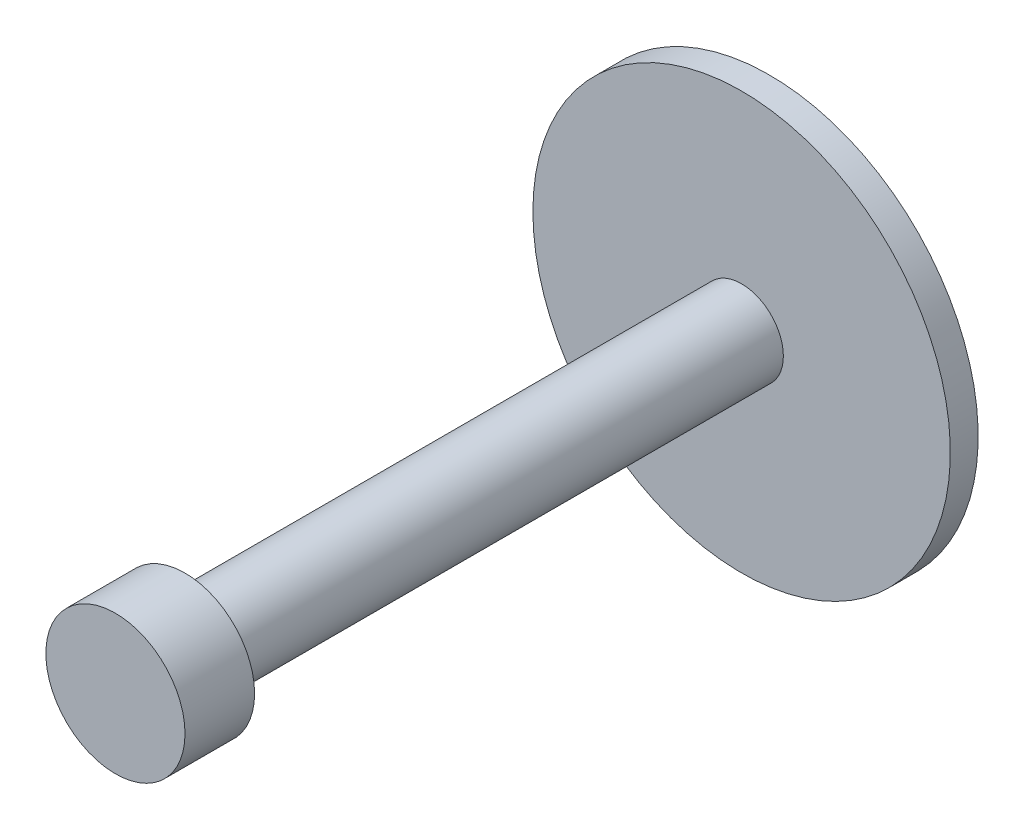
ISO-10303-21;
HEADER;
FILE_DESCRIPTION(('STEP AP214'),'2;1');
FILE_NAME('part.step','',(''),(''),'','','');
FILE_SCHEMA(('AUTOMOTIVE_DESIGN { 1 0 10303 214 1 1 1 1 }'));
ENDSEC;
DATA;
#1=APPLICATION_CONTEXT('core data for automotive mechanical design processes');
#2=APPLICATION_PROTOCOL_DEFINITION('international standard','automotive_design',2000,#1);
#3=PRODUCT_CONTEXT('',#1,'mechanical');
#4=PRODUCT('Part','Part','',(#3));
#5=PRODUCT_RELATED_PRODUCT_CATEGORY('part','',(#4));
#6=PRODUCT_DEFINITION_FORMATION('','',#4);
#7=PRODUCT_DEFINITION_CONTEXT('part definition',#1,'design');
#8=PRODUCT_DEFINITION('design','',#6,#7);
#9=PRODUCT_DEFINITION_SHAPE('','',#8);
#10=(LENGTH_UNIT() NAMED_UNIT(*) SI_UNIT(.MILLI.,.METRE.));
#11=(NAMED_UNIT(*) PLANE_ANGLE_UNIT() SI_UNIT($,.RADIAN.));
#12=(NAMED_UNIT(*) SI_UNIT($,.STERADIAN.) SOLID_ANGLE_UNIT());
#13=UNCERTAINTY_MEASURE_WITH_UNIT(LENGTH_MEASURE(1.E-05),#10,'distance_accuracy_value','');
#14=(GEOMETRIC_REPRESENTATION_CONTEXT(3) GLOBAL_UNCERTAINTY_ASSIGNED_CONTEXT((#13)) GLOBAL_UNIT_ASSIGNED_CONTEXT((#10,
#11,#12)) REPRESENTATION_CONTEXT('',''));
#15=CARTESIAN_POINT('',(0.,0.,0.));
#16=DIRECTION('',(0.,0.,1.));
#17=DIRECTION('',(1.,0.,0.));
#18=AXIS2_PLACEMENT_3D('',#15,#16,#17);
#19=CARTESIAN_POINT('',(0.,0.,200.));
#20=DIRECTION('',(0.,0.,-1.));
#21=DIRECTION('',(-1.,0.,0.));
#22=AXIS2_PLACEMENT_3D('',#19,#20,#21);
#23=CYLINDRICAL_SURFACE('',#22,15.);
#24=CARTESIAN_POINT('',(0.,0.,200.));
#25=DIRECTION('',(0.,0.,1.));
#26=DIRECTION('',(1.,0.,0.));
#27=AXIS2_PLACEMENT_3D('',#24,#25,#26);
#28=CIRCLE('',#27,15.);
#29=CARTESIAN_POINT('',(15.,0.,200.));
#30=VERTEX_POINT('',#29);
#31=EDGE_CURVE('E10',#30,#30,#28,.T.);
#32=ORIENTED_EDGE('',*,*,#31,.F.);
#33=EDGE_LOOP('',(#32));
#34=FACE_BOUND('',#33,.T.);
#35=CARTESIAN_POINT('',(0.,0.,0.));
#36=DIRECTION('',(0.,0.,1.));
#37=DIRECTION('',(1.,0.,0.));
#38=AXIS2_PLACEMENT_3D('',#35,#36,#37);
#39=CIRCLE('',#38,15.);
#40=CARTESIAN_POINT('',(15.,0.,0.));
#41=VERTEX_POINT('',#40);
#42=EDGE_CURVE('E40',#41,#41,#39,.T.);
#43=ORIENTED_EDGE('',*,*,#42,.T.);
#44=EDGE_LOOP('',(#43));
#45=FACE_BOUND('',#44,.T.);
#46=ADVANCED_FACE('F37',(#34,#45),#23,.T.);
#47=CARTESIAN_POINT('',(0.,0.,225.));
#48=DIRECTION('',(0.,0.,-1.));
#49=DIRECTION('',(-1.,0.,0.));
#50=AXIS2_PLACEMENT_3D('',#47,#48,#49);
#51=CYLINDRICAL_SURFACE('',#50,25.);
#52=CARTESIAN_POINT('',(0.,0.,225.));
#53=DIRECTION('',(0.,0.,1.));
#54=DIRECTION('',(1.,0.,0.));
#55=AXIS2_PLACEMENT_3D('',#52,#53,#54);
#56=CIRCLE('',#55,25.);
#57=CARTESIAN_POINT('',(25.,0.,225.));
#58=VERTEX_POINT('',#57);
#59=EDGE_CURVE('E45',#58,#58,#56,.T.);
#60=ORIENTED_EDGE('',*,*,#59,.F.);
#61=EDGE_LOOP('',(#60));
#62=FACE_BOUND('',#61,.T.);
#63=CARTESIAN_POINT('',(0.,0.,200.));
#64=DIRECTION('',(0.,0.,1.));
#65=DIRECTION('',(1.,0.,0.));
#66=AXIS2_PLACEMENT_3D('',#63,#64,#65);
#67=CIRCLE('',#66,25.);
#68=CARTESIAN_POINT('',(25.,0.,200.));
#69=VERTEX_POINT('',#68);
#70=EDGE_CURVE('E50',#69,#69,#67,.T.);
#71=ORIENTED_EDGE('',*,*,#70,.T.);
#72=EDGE_LOOP('',(#71));
#73=FACE_BOUND('',#72,.T.);
#74=ADVANCED_FACE('F117',(#62,#73),#51,.T.);
#75=CARTESIAN_POINT('',(0.,0.,225.));
#76=DIRECTION('',(0.,0.,1.));
#77=DIRECTION('',(1.,0.,0.));
#78=AXIS2_PLACEMENT_3D('',#75,#76,#77);
#79=PLANE('',#78);
#80=ORIENTED_EDGE('',*,*,#59,.T.);
#81=EDGE_LOOP('',(#80));
#82=FACE_BOUND('',#81,.T.);
#83=ADVANCED_FACE('F122',(#82),#79,.T.);
#84=CARTESIAN_POINT('',(0.,0.,200.));
#85=DIRECTION('',(0.,0.,1.));
#86=DIRECTION('',(1.,0.,0.));
#87=AXIS2_PLACEMENT_3D('',#84,#85,#86);
#88=PLANE('',#87);
#89=ORIENTED_EDGE('',*,*,#31,.T.);
#90=EDGE_LOOP('',(#89));
#91=FACE_BOUND('',#90,.T.);
#92=ORIENTED_EDGE('',*,*,#70,.F.);
#93=EDGE_LOOP('',(#92));
#94=FACE_BOUND('',#93,.T.);
#95=ADVANCED_FACE('F102',(#91,#94),#88,.F.);
#96=CARTESIAN_POINT('',(0.,0.,-10.));
#97=DIRECTION('',(0.,0.,1.));
#98=DIRECTION('',(1.,0.,0.));
#99=AXIS2_PLACEMENT_3D('',#96,#97,#98);
#100=CYLINDRICAL_SURFACE('',#99,75.);
#101=CARTESIAN_POINT('',(0.,0.,-10.));
#102=DIRECTION('',(0.,0.,-1.));
#103=DIRECTION('',(-1.,0.,0.));
#104=AXIS2_PLACEMENT_3D('',#101,#102,#103);
#105=CIRCLE('',#104,75.);
#106=CARTESIAN_POINT('',(-75.,0.,-10.));
#107=VERTEX_POINT('',#106);
#108=EDGE_CURVE('E60',#107,#107,#105,.T.);
#109=ORIENTED_EDGE('',*,*,#108,.F.);
#110=EDGE_LOOP('',(#109));
#111=FACE_BOUND('',#110,.T.);
#112=CARTESIAN_POINT('',(0.,0.,0.));
#113=DIRECTION('',(0.,0.,-1.));
#114=DIRECTION('',(-1.,0.,0.));
#115=AXIS2_PLACEMENT_3D('',#112,#113,#114);
#116=CIRCLE('',#115,75.);
#117=CARTESIAN_POINT('',(-75.,0.,0.));
#118=VERTEX_POINT('',#117);
#119=EDGE_CURVE('E56',#118,#118,#116,.T.);
#120=ORIENTED_EDGE('',*,*,#119,.T.);
#121=EDGE_LOOP('',(#120));
#122=FACE_BOUND('',#121,.T.);
#123=ADVANCED_FACE('F94',(#111,#122),#100,.T.);
#124=CARTESIAN_POINT('',(0.,0.,-10.));
#125=DIRECTION('',(0.,0.,-1.));
#126=DIRECTION('',(-1.,0.,0.));
#127=AXIS2_PLACEMENT_3D('',#124,#125,#126);
#128=PLANE('',#127);
#129=CARTESIAN_POINT('',(0.,30.,-10.));
#130=DIRECTION('',(0.,0.,-1.));
#131=DIRECTION('',(-1.,0.,0.));
#132=AXIS2_PLACEMENT_3D('',#129,#130,#131);
#133=CIRCLE('',#132,7.5);
#134=CARTESIAN_POINT('',(-7.5,30.,-10.));
#135=VERTEX_POINT('',#134);
#136=EDGE_CURVE('E73',#135,#135,#133,.T.);
#137=ORIENTED_EDGE('',*,*,#136,.F.);
#138=EDGE_LOOP('',(#137));
#139=FACE_BOUND('',#138,.T.);
#140=CARTESIAN_POINT('',(0.,-30.,-10.));
#141=DIRECTION('',(0.,0.,-1.));
#142=DIRECTION('',(-1.,0.,0.));
#143=AXIS2_PLACEMENT_3D('',#140,#141,#142);
#144=CIRCLE('',#143,7.5);
#145=CARTESIAN_POINT('',(-7.5,-30.,-10.));
#146=VERTEX_POINT('',#145);
#147=EDGE_CURVE('E65',#146,#146,#144,.T.);
#148=ORIENTED_EDGE('',*,*,#147,.F.);
#149=EDGE_LOOP('',(#148));
#150=FACE_BOUND('',#149,.T.);
#151=ORIENTED_EDGE('',*,*,#108,.T.);
#152=EDGE_LOOP('',(#151));
#153=FACE_BOUND('',#152,.T.);
#154=ADVANCED_FACE('F90',(#139,#150,#153),#128,.T.);
#155=CARTESIAN_POINT('',(0.,0.,0.));
#156=DIRECTION('',(0.,0.,-1.));
#157=DIRECTION('',(-1.,0.,0.));
#158=AXIS2_PLACEMENT_3D('',#155,#156,#157);
#159=PLANE('',#158);
#160=ORIENTED_EDGE('',*,*,#42,.F.);
#161=EDGE_LOOP('',(#160));
#162=FACE_BOUND('',#161,.T.);
#163=ORIENTED_EDGE('',*,*,#119,.F.);
#164=EDGE_LOOP('',(#163));
#165=FACE_BOUND('',#164,.T.);
#166=ADVANCED_FACE('F93',(#162,#165),#159,.F.);
#167=CARTESIAN_POINT('',(0.,-30.,-9.));
#168=DIRECTION('',(0.,0.,-1.));
#169=DIRECTION('',(-1.,0.,0.));
#170=AXIS2_PLACEMENT_3D('',#167,#168,#169);
#171=CYLINDRICAL_SURFACE('',#170,7.5);
#172=CARTESIAN_POINT('',(0.,-30.,-9.));
#173=DIRECTION('',(0.,0.,-1.));
#174=DIRECTION('',(-1.,0.,0.));
#175=AXIS2_PLACEMENT_3D('',#172,#173,#174);
#176=CIRCLE('',#175,7.5);
#177=CARTESIAN_POINT('',(-7.5,-30.,-9.));
#178=VERTEX_POINT('',#177);
#179=EDGE_CURVE('E69',#178,#178,#176,.T.);
#180=ORIENTED_EDGE('',*,*,#179,.F.);
#181=EDGE_LOOP('',(#180));
#182=FACE_BOUND('',#181,.T.);
#183=ORIENTED_EDGE('',*,*,#147,.T.);
#184=EDGE_LOOP('',(#183));
#185=FACE_BOUND('',#184,.T.);
#186=ADVANCED_FACE('F107',(#182,#185),#171,.F.);
#187=CARTESIAN_POINT('',(0.,-30.,-9.));
#188=DIRECTION('',(0.,0.,-1.));
#189=DIRECTION('',(-1.,0.,0.));
#190=AXIS2_PLACEMENT_3D('',#187,#188,#189);
#191=PLANE('',#190);
#192=ORIENTED_EDGE('',*,*,#179,.T.);
#193=EDGE_LOOP('',(#192));
#194=FACE_BOUND('',#193,.T.);
#195=ADVANCED_FACE('F86',(#194),#191,.T.);
#196=CARTESIAN_POINT('',(0.,30.,-9.));
#197=DIRECTION('',(0.,0.,-1.));
#198=DIRECTION('',(-1.,0.,0.));
#199=AXIS2_PLACEMENT_3D('',#196,#197,#198);
#200=CYLINDRICAL_SURFACE('',#199,7.5);
#201=CARTESIAN_POINT('',(0.,30.,-9.));
#202=DIRECTION('',(0.,0.,-1.));
#203=DIRECTION('',(-1.,0.,0.));
#204=AXIS2_PLACEMENT_3D('',#201,#202,#203);
#205=CIRCLE('',#204,7.5);
#206=CARTESIAN_POINT('',(-7.5,30.,-9.));
#207=VERTEX_POINT('',#206);
#208=EDGE_CURVE('E61',#207,#207,#205,.T.);
#209=ORIENTED_EDGE('',*,*,#208,.F.);
#210=EDGE_LOOP('',(#209));
#211=FACE_BOUND('',#210,.T.);
#212=ORIENTED_EDGE('',*,*,#136,.T.);
#213=EDGE_LOOP('',(#212));
#214=FACE_BOUND('',#213,.T.);
#215=ADVANCED_FACE('F83',(#211,#214),#200,.F.);
#216=CARTESIAN_POINT('',(0.,30.,-9.));
#217=DIRECTION('',(0.,0.,-1.));
#218=DIRECTION('',(-1.,0.,0.));
#219=AXIS2_PLACEMENT_3D('',#216,#217,#218);
#220=PLANE('',#219);
#221=ORIENTED_EDGE('',*,*,#208,.T.);
#222=EDGE_LOOP('',(#221));
#223=FACE_BOUND('',#222,.T.);
#224=ADVANCED_FACE('F81',(#223),#220,.T.);
#225=CLOSED_SHELL('',(#46,#74,#83,#95,#123,#154,#166,#186,#195,#215,#224));
#226=MANIFOLD_SOLID_BREP('B2',#225);
#227=ADVANCED_BREP_SHAPE_REPRESENTATION('',(#18,#226),#14);
#228=SHAPE_DEFINITION_REPRESENTATION(#9,#227);
ENDSEC;
END-ISO-10303-21;
